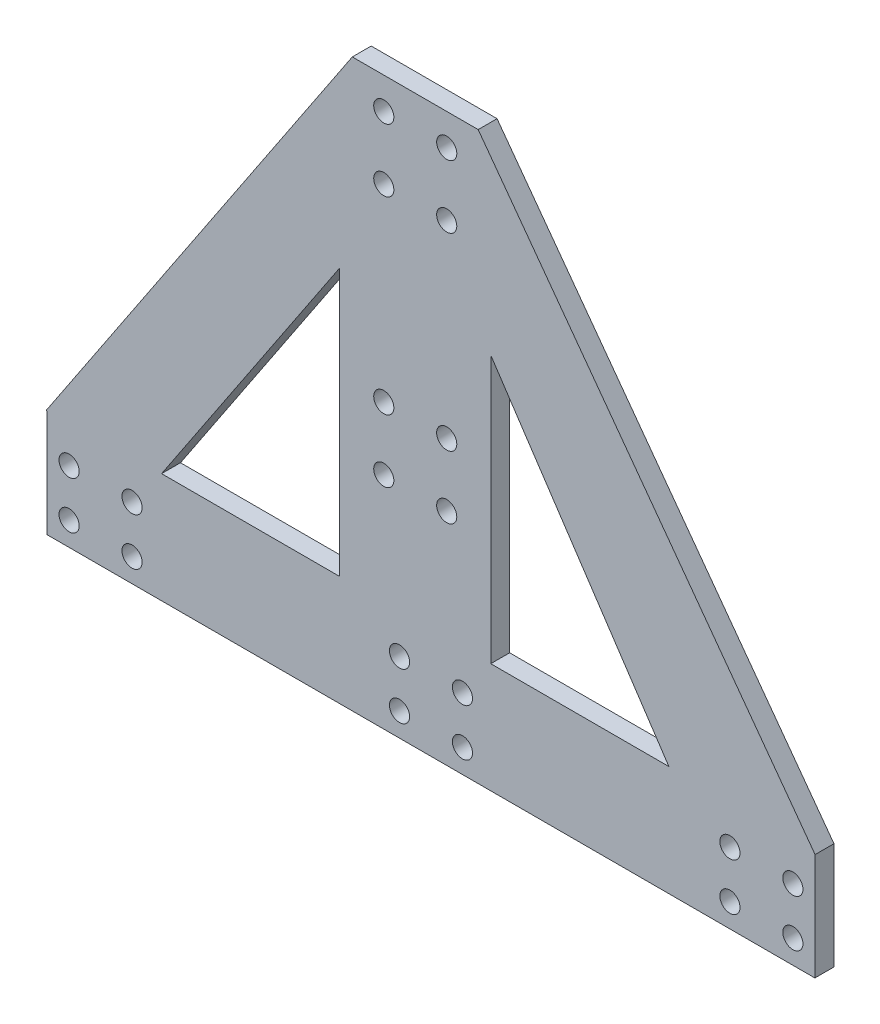
ISO-10303-21;
HEADER;
FILE_DESCRIPTION(('STEP AP214'),'2;1');
FILE_NAME('part.step','',(''),(''),'','','');
FILE_SCHEMA(('AUTOMOTIVE_DESIGN { 1 0 10303 214 1 1 1 1 }'));
ENDSEC;
DATA;
#1=APPLICATION_CONTEXT('core data for automotive mechanical design processes');
#2=APPLICATION_PROTOCOL_DEFINITION('international standard','automotive_design',2000,#1);
#3=PRODUCT_CONTEXT('',#1,'mechanical');
#4=PRODUCT('Part','Part','',(#3));
#5=PRODUCT_RELATED_PRODUCT_CATEGORY('part','',(#4));
#6=PRODUCT_DEFINITION_FORMATION('','',#4);
#7=PRODUCT_DEFINITION_CONTEXT('part definition',#1,'design');
#8=PRODUCT_DEFINITION('design','',#6,#7);
#9=PRODUCT_DEFINITION_SHAPE('','',#8);
#10=(LENGTH_UNIT() NAMED_UNIT(*) SI_UNIT(.MILLI.,.METRE.));
#11=(NAMED_UNIT(*) PLANE_ANGLE_UNIT() SI_UNIT($,.RADIAN.));
#12=(NAMED_UNIT(*) SI_UNIT($,.STERADIAN.) SOLID_ANGLE_UNIT());
#13=UNCERTAINTY_MEASURE_WITH_UNIT(LENGTH_MEASURE(1.E-05),#10,'distance_accuracy_value','');
#14=(GEOMETRIC_REPRESENTATION_CONTEXT(3) GLOBAL_UNCERTAINTY_ASSIGNED_CONTEXT((#13)) GLOBAL_UNIT_ASSIGNED_CONTEXT((#10,
#11,#12)) REPRESENTATION_CONTEXT('',''));
#15=CARTESIAN_POINT('',(0.,0.,0.));
#16=DIRECTION('',(0.,0.,1.));
#17=DIRECTION('',(1.,0.,0.));
#18=AXIS2_PLACEMENT_3D('',#15,#16,#17);
#19=CARTESIAN_POINT('',(-50.,-75.,3.));
#20=DIRECTION('',(0.832050294337844,-0.554700196225229,0.));
#21=DIRECTION('',(0.554700196225229,0.832050294337844,0.));
#22=AXIS2_PLACEMENT_3D('',#19,#20,#21);
#23=PLANE('',#22);
#24=DIRECTION('',(-0.554700196225229,-0.832050294337844,0.));
#25=VECTOR('',#24,1.);
#26=CARTESIAN_POINT('',(-50.,-75.,0.));
#27=LINE('',#26,#25);
#28=CARTESIAN_POINT('',(0.,0.,0.));
#29=VERTEX_POINT('',#28);
#30=CARTESIAN_POINT('',(-48.6666666666667,-73.,0.));
#31=VERTEX_POINT('',#30);
#32=EDGE_CURVE('E186',#29,#31,#27,.T.);
#33=ORIENTED_EDGE('',*,*,#32,.T.);
#34=DIRECTION('',(0.,0.,1.));
#35=VECTOR('',#34,1.);
#36=CARTESIAN_POINT('',(-48.6666666666667,-73.,3.));
#37=LINE('',#36,#35);
#38=CARTESIAN_POINT('',(-48.6666666666667,-73.,3.));
#39=VERTEX_POINT('',#38);
#40=EDGE_CURVE('E224',#31,#39,#37,.T.);
#41=ORIENTED_EDGE('',*,*,#40,.T.);
#42=DIRECTION('',(-0.554700196225229,-0.832050294337844,0.));
#43=VECTOR('',#42,1.);
#44=CARTESIAN_POINT('',(-50.,-75.,3.));
#45=LINE('',#44,#43);
#46=CARTESIAN_POINT('',(0.,0.,3.));
#47=VERTEX_POINT('',#46);
#48=EDGE_CURVE('E173',#47,#39,#45,.T.);
#49=ORIENTED_EDGE('',*,*,#48,.F.);
#50=DIRECTION('',(0.,0.,-1.));
#51=VECTOR('',#50,1.);
#52=CARTESIAN_POINT('',(0.,0.,3.));
#53=LINE('',#52,#51);
#54=EDGE_CURVE('E185',#47,#29,#53,.T.);
#55=ORIENTED_EDGE('',*,*,#54,.T.);
#56=EDGE_LOOP('',(#33,#41,#49,#55));
#57=FACE_BOUND('',#56,.T.);
#58=ADVANCED_FACE('F43',(#57),#23,.F.);
#59=CARTESIAN_POINT('',(75.,-90.,3.));
#60=DIRECTION('',(0.,1.,0.));
#61=DIRECTION('',(-1.,0.,0.));
#62=AXIS2_PLACEMENT_3D('',#59,#60,#61);
#63=PLANE('',#62);
#64=DIRECTION('',(1.,0.,0.));
#65=VECTOR('',#64,1.);
#66=CARTESIAN_POINT('',(75.,-90.,0.));
#67=LINE('',#66,#65);
#68=CARTESIAN_POINT('',(-48.5,-90.,0.));
#69=VERTEX_POINT('',#68);
#70=CARTESIAN_POINT('',(73.5,-90.,0.));
#71=VERTEX_POINT('',#70);
#72=EDGE_CURVE('E190',#69,#71,#67,.T.);
#73=ORIENTED_EDGE('',*,*,#72,.T.);
#74=DIRECTION('',(0.,0.,1.));
#75=VECTOR('',#74,1.);
#76=CARTESIAN_POINT('',(73.5,-90.,0.));
#77=LINE('',#76,#75);
#78=CARTESIAN_POINT('',(73.5,-90.,3.));
#79=VERTEX_POINT('',#78);
#80=EDGE_CURVE('E170',#71,#79,#77,.T.);
#81=ORIENTED_EDGE('',*,*,#80,.T.);
#82=DIRECTION('',(1.,0.,0.));
#83=VECTOR('',#82,1.);
#84=CARTESIAN_POINT('',(75.,-90.,3.));
#85=LINE('',#84,#83);
#86=CARTESIAN_POINT('',(-48.5,-90.,3.));
#87=VERTEX_POINT('',#86);
#88=EDGE_CURVE('E162',#87,#79,#85,.T.);
#89=ORIENTED_EDGE('',*,*,#88,.F.);
#90=DIRECTION('',(0.,0.,1.));
#91=VECTOR('',#90,1.);
#92=CARTESIAN_POINT('',(-48.5,-90.,0.));
#93=LINE('',#92,#91);
#94=EDGE_CURVE('E143',#69,#87,#93,.T.);
#95=ORIENTED_EDGE('',*,*,#94,.F.);
#96=EDGE_LOOP('',(#73,#81,#89,#95));
#97=FACE_BOUND('',#96,.T.);
#98=ADVANCED_FACE('F169',(#97),#63,.F.);
#99=CARTESIAN_POINT('',(20.,0.,3.));
#100=DIRECTION('',(-0.806404995855706,-0.591363663627517,0.));
#101=DIRECTION('',(0.591363663627517,-0.806404995855706,0.));
#102=AXIS2_PLACEMENT_3D('',#99,#100,#101);
#103=PLANE('',#102);
#104=DIRECTION('',(-0.591363663627517,0.806404995855705,0.));
#105=VECTOR('',#104,1.);
#106=CARTESIAN_POINT('',(20.,0.,3.));
#107=LINE('',#106,#105);
#108=CARTESIAN_POINT('',(73.5333333333333,-73.,3.));
#109=VERTEX_POINT('',#108);
#110=CARTESIAN_POINT('',(20.,0.,3.));
#111=VERTEX_POINT('',#110);
#112=EDGE_CURVE('E172',#109,#111,#107,.T.);
#113=ORIENTED_EDGE('',*,*,#112,.F.);
#114=DIRECTION('',(0.,0.,-1.));
#115=VECTOR('',#114,1.);
#116=CARTESIAN_POINT('',(73.5333333333333,-73.,3.));
#117=LINE('',#116,#115);
#118=CARTESIAN_POINT('',(73.5333333333333,-73.,0.));
#119=VERTEX_POINT('',#118);
#120=EDGE_CURVE('E191',#109,#119,#117,.T.);
#121=ORIENTED_EDGE('',*,*,#120,.T.);
#122=DIRECTION('',(-0.591363663627517,0.806404995855705,0.));
#123=VECTOR('',#122,1.);
#124=CARTESIAN_POINT('',(20.,0.,0.));
#125=LINE('',#124,#123);
#126=CARTESIAN_POINT('',(20.,0.,0.));
#127=VERTEX_POINT('',#126);
#128=EDGE_CURVE('E194',#119,#127,#125,.T.);
#129=ORIENTED_EDGE('',*,*,#128,.T.);
#130=DIRECTION('',(0.,0.,-1.));
#131=VECTOR('',#130,1.);
#132=CARTESIAN_POINT('',(20.,0.,3.));
#133=LINE('',#132,#131);
#134=EDGE_CURVE('E51',#111,#127,#133,.T.);
#135=ORIENTED_EDGE('',*,*,#134,.F.);
#136=EDGE_LOOP('',(#113,#121,#129,#135));
#137=FACE_BOUND('',#136,.T.);
#138=ADVANCED_FACE('F228',(#137),#103,.F.);
#139=CARTESIAN_POINT('',(0.,0.,3.));
#140=DIRECTION('',(0.,-1.,0.));
#141=DIRECTION('',(0.,0.,-1.));
#142=AXIS2_PLACEMENT_3D('',#139,#140,#141);
#143=PLANE('',#142);
#144=DIRECTION('',(-1.,0.,0.));
#145=VECTOR('',#144,1.);
#146=CARTESIAN_POINT('',(0.,0.,0.));
#147=LINE('',#146,#145);
#148=EDGE_CURVE('E179',#127,#29,#147,.T.);
#149=ORIENTED_EDGE('',*,*,#148,.T.);
#150=ORIENTED_EDGE('',*,*,#54,.F.);
#151=DIRECTION('',(-1.,0.,0.));
#152=VECTOR('',#151,1.);
#153=CARTESIAN_POINT('',(0.,0.,3.));
#154=LINE('',#153,#152);
#155=EDGE_CURVE('E177',#111,#47,#154,.T.);
#156=ORIENTED_EDGE('',*,*,#155,.F.);
#157=ORIENTED_EDGE('',*,*,#134,.T.);
#158=EDGE_LOOP('',(#149,#150,#156,#157));
#159=FACE_BOUND('',#158,.T.);
#160=ADVANCED_FACE('F207',(#159),#143,.F.);
#161=CARTESIAN_POINT('',(0.,0.,3.));
#162=DIRECTION('',(0.,0.,-1.));
#163=DIRECTION('',(-1.,0.,0.));
#164=AXIS2_PLACEMENT_3D('',#161,#162,#163);
#165=PLANE('',#164);
#166=DIRECTION('',(1.,0.,0.));
#167=VECTOR('',#166,1.);
#168=CARTESIAN_POINT('',(-1.99999999999999,-72.5,3.));
#169=LINE('',#168,#167);
#170=CARTESIAN_POINT('',(-30.3055769560134,-72.5,3.));
#171=VERTEX_POINT('',#170);
#172=CARTESIAN_POINT('',(-1.99999999999999,-72.5,3.));
#173=VERTEX_POINT('',#172);
#174=EDGE_CURVE('E340',#171,#173,#169,.T.);
#175=ORIENTED_EDGE('',*,*,#174,.F.);
#176=DIRECTION('',(-0.554700196225229,-0.832050294337844,0.));
#177=VECTOR('',#176,1.);
#178=CARTESIAN_POINT('',(-30.3055769560134,-72.5,3.));
#179=LINE('',#178,#177);
#180=CARTESIAN_POINT('',(-2.,-30.0416345659799,3.));
#181=VERTEX_POINT('',#180);
#182=EDGE_CURVE('E58',#181,#171,#179,.T.);
#183=ORIENTED_EDGE('',*,*,#182,.F.);
#184=DIRECTION('',(0.,1.,0.));
#185=VECTOR('',#184,1.);
#186=CARTESIAN_POINT('',(-2.,-30.0416345659799,3.));
#187=LINE('',#186,#185);
#188=EDGE_CURVE('E327',#173,#181,#187,.T.);
#189=ORIENTED_EDGE('',*,*,#188,.F.);
#190=EDGE_LOOP('',(#175,#183,#189));
#191=FACE_BOUND('',#190,.T.);
#192=CARTESIAN_POINT('',(70.,-86.25,3.));
#193=DIRECTION('',(0.,0.,1.));
#194=DIRECTION('',(-1.,0.,0.));
#195=AXIS2_PLACEMENT_3D('',#192,#193,#194);
#196=CIRCLE('',#195,1.60000000000001);
#197=CARTESIAN_POINT('',(68.4,-86.25,3.));
#198=VERTEX_POINT('',#197);
#199=EDGE_CURVE('E312',#198,#198,#196,.T.);
#200=ORIENTED_EDGE('',*,*,#199,.F.);
#201=EDGE_LOOP('',(#200));
#202=FACE_BOUND('',#201,.T.);
#203=CARTESIAN_POINT('',(70.,-78.75,3.));
#204=DIRECTION('',(0.,0.,1.));
#205=DIRECTION('',(1.,0.,0.));
#206=AXIS2_PLACEMENT_3D('',#203,#204,#205);
#207=CIRCLE('',#206,1.59999999999999);
#208=CARTESIAN_POINT('',(71.6,-78.75,3.));
#209=VERTEX_POINT('',#208);
#210=EDGE_CURVE('E311',#209,#209,#207,.T.);
#211=ORIENTED_EDGE('',*,*,#210,.F.);
#212=EDGE_LOOP('',(#211));
#213=FACE_BOUND('',#212,.T.);
#214=CARTESIAN_POINT('',(60.,-86.25,3.));
#215=DIRECTION('',(0.,0.,1.));
#216=DIRECTION('',(1.,0.,0.));
#217=AXIS2_PLACEMENT_3D('',#214,#215,#216);
#218=CIRCLE('',#217,1.6);
#219=CARTESIAN_POINT('',(61.6,-86.25,3.));
#220=VERTEX_POINT('',#219);
#221=EDGE_CURVE('E296',#220,#220,#218,.T.);
#222=ORIENTED_EDGE('',*,*,#221,.F.);
#223=EDGE_LOOP('',(#222));
#224=FACE_BOUND('',#223,.T.);
#225=DIRECTION('',(1.,0.,0.));
#226=VECTOR('',#225,1.);
#227=CARTESIAN_POINT('',(22.,-72.4999999999999,3.));
#228=LINE('',#227,#226);
#229=CARTESIAN_POINT('',(22.,-72.4999999999999,3.));
#230=VERTEX_POINT('',#229);
#231=CARTESIAN_POINT('',(50.3055769560134,-72.5,3.));
#232=VERTEX_POINT('',#231);
#233=EDGE_CURVE('E395',#230,#232,#228,.T.);
#234=ORIENTED_EDGE('',*,*,#233,.F.);
#235=DIRECTION('',(0.,-1.,0.));
#236=VECTOR('',#235,1.);
#237=CARTESIAN_POINT('',(22.,-30.0416345659799,3.));
#238=LINE('',#237,#236);
#239=CARTESIAN_POINT('',(22.,-30.0416345659799,3.));
#240=VERTEX_POINT('',#239);
#241=EDGE_CURVE('E66',#240,#230,#238,.T.);
#242=ORIENTED_EDGE('',*,*,#241,.F.);
#243=DIRECTION('',(-0.554700196225229,0.832050294337844,0.));
#244=VECTOR('',#243,1.);
#245=CARTESIAN_POINT('',(50.3055769560134,-72.5,3.));
#246=LINE('',#245,#244);
#247=EDGE_CURVE('E383',#232,#240,#246,.T.);
#248=ORIENTED_EDGE('',*,*,#247,.F.);
#249=EDGE_LOOP('',(#234,#242,#248));
#250=FACE_BOUND('',#249,.T.);
#251=CARTESIAN_POINT('',(7.50000000000001,-86.25,3.));
#252=DIRECTION('',(0.,0.,1.));
#253=DIRECTION('',(1.,0.,0.));
#254=AXIS2_PLACEMENT_3D('',#251,#252,#253);
#255=CIRCLE('',#254,1.6);
#256=CARTESIAN_POINT('',(9.10000000000001,-86.25,3.));
#257=VERTEX_POINT('',#256);
#258=EDGE_CURVE('E374',#257,#257,#255,.T.);
#259=ORIENTED_EDGE('',*,*,#258,.F.);
#260=EDGE_LOOP('',(#259));
#261=FACE_BOUND('',#260,.T.);
#262=CARTESIAN_POINT('',(17.5,-86.25,3.));
#263=DIRECTION('',(0.,0.,1.));
#264=DIRECTION('',(-1.,0.,0.));
#265=AXIS2_PLACEMENT_3D('',#262,#263,#264);
#266=CIRCLE('',#265,1.6);
#267=CARTESIAN_POINT('',(15.9,-86.25,3.));
#268=VERTEX_POINT('',#267);
#269=EDGE_CURVE('E365',#268,#268,#266,.T.);
#270=ORIENTED_EDGE('',*,*,#269,.F.);
#271=EDGE_LOOP('',(#270));
#272=FACE_BOUND('',#271,.T.);
#273=CARTESIAN_POINT('',(15.,-5.,3.));
#274=DIRECTION('',(0.,0.,1.));
#275=DIRECTION('',(-1.,0.,0.));
#276=AXIS2_PLACEMENT_3D('',#273,#274,#275);
#277=CIRCLE('',#276,1.6);
#278=CARTESIAN_POINT('',(13.4,-5.,3.));
#279=VERTEX_POINT('',#278);
#280=EDGE_CURVE('E239',#279,#279,#277,.T.);
#281=ORIENTED_EDGE('',*,*,#280,.F.);
#282=EDGE_LOOP('',(#281));
#283=FACE_BOUND('',#282,.T.);
#284=CARTESIAN_POINT('',(15.,-15.,3.));
#285=DIRECTION('',(0.,0.,1.));
#286=DIRECTION('',(1.,0.,0.));
#287=AXIS2_PLACEMENT_3D('',#284,#285,#286);
#288=CIRCLE('',#287,1.6);
#289=CARTESIAN_POINT('',(16.6,-15.,3.));
#290=VERTEX_POINT('',#289);
#291=EDGE_CURVE('E264',#290,#290,#288,.T.);
#292=ORIENTED_EDGE('',*,*,#291,.F.);
#293=EDGE_LOOP('',(#292));
#294=FACE_BOUND('',#293,.T.);
#295=CARTESIAN_POINT('',(5.,-15.,3.));
#296=DIRECTION('',(0.,0.,1.));
#297=DIRECTION('',(-1.,0.,0.));
#298=AXIS2_PLACEMENT_3D('',#295,#296,#297);
#299=CIRCLE('',#298,1.6);
#300=CARTESIAN_POINT('',(3.4,-15.,3.));
#301=VERTEX_POINT('',#300);
#302=EDGE_CURVE('E256',#301,#301,#299,.T.);
#303=ORIENTED_EDGE('',*,*,#302,.F.);
#304=EDGE_LOOP('',(#303));
#305=FACE_BOUND('',#304,.T.);
#306=CARTESIAN_POINT('',(-45.,-86.25,3.));
#307=DIRECTION('',(0.,0.,1.));
#308=DIRECTION('',(1.,0.,0.));
#309=AXIS2_PLACEMENT_3D('',#306,#307,#308);
#310=CIRCLE('',#309,1.6);
#311=CARTESIAN_POINT('',(-43.4,-86.25,3.));
#312=VERTEX_POINT('',#311);
#313=EDGE_CURVE('E247',#312,#312,#310,.T.);
#314=ORIENTED_EDGE('',*,*,#313,.F.);
#315=EDGE_LOOP('',(#314));
#316=FACE_BOUND('',#315,.T.);
#317=CARTESIAN_POINT('',(60.,-78.75,3.));
#318=DIRECTION('',(0.,0.,1.));
#319=DIRECTION('',(-1.,0.,0.));
#320=AXIS2_PLACEMENT_3D('',#317,#318,#319);
#321=CIRCLE('',#320,1.60000000000001);
#322=CARTESIAN_POINT('',(58.4,-78.75,3.));
#323=VERTEX_POINT('',#322);
#324=EDGE_CURVE('E295',#323,#323,#321,.T.);
#325=ORIENTED_EDGE('',*,*,#324,.F.);
#326=EDGE_LOOP('',(#325));
#327=FACE_BOUND('',#326,.T.);
#328=CARTESIAN_POINT('',(-35.,-78.75,3.));
#329=DIRECTION('',(0.,0.,1.));
#330=DIRECTION('',(1.,0.,0.));
#331=AXIS2_PLACEMENT_3D('',#328,#329,#330);
#332=CIRCLE('',#331,1.6);
#333=CARTESIAN_POINT('',(-33.4,-78.75,3.));
#334=VERTEX_POINT('',#333);
#335=EDGE_CURVE('E280',#334,#334,#332,.T.);
#336=ORIENTED_EDGE('',*,*,#335,.F.);
#337=EDGE_LOOP('',(#336));
#338=FACE_BOUND('',#337,.T.);
#339=CARTESIAN_POINT('',(-35.,-86.25,3.));
#340=DIRECTION('',(0.,0.,1.));
#341=DIRECTION('',(-1.,0.,0.));
#342=AXIS2_PLACEMENT_3D('',#339,#340,#341);
#343=CIRCLE('',#342,1.6);
#344=CARTESIAN_POINT('',(-36.6,-86.25,3.));
#345=VERTEX_POINT('',#344);
#346=EDGE_CURVE('E279',#345,#345,#343,.T.);
#347=ORIENTED_EDGE('',*,*,#346,.F.);
#348=EDGE_LOOP('',(#347));
#349=FACE_BOUND('',#348,.T.);
#350=CARTESIAN_POINT('',(-45.,-78.75,3.));
#351=DIRECTION('',(0.,0.,1.));
#352=DIRECTION('',(-1.,0.,0.));
#353=AXIS2_PLACEMENT_3D('',#350,#351,#352);
#354=CIRCLE('',#353,1.6);
#355=CARTESIAN_POINT('',(-46.6,-78.75,3.));
#356=VERTEX_POINT('',#355);
#357=EDGE_CURVE('E248',#356,#356,#354,.T.);
#358=ORIENTED_EDGE('',*,*,#357,.F.);
#359=EDGE_LOOP('',(#358));
#360=FACE_BOUND('',#359,.T.);
#361=CARTESIAN_POINT('',(5.00000000000001,-55.,3.));
#362=DIRECTION('',(0.,0.,1.));
#363=DIRECTION('',(-1.,0.,0.));
#364=AXIS2_PLACEMENT_3D('',#361,#362,#363);
#365=CIRCLE('',#364,1.6);
#366=CARTESIAN_POINT('',(3.40000000000002,-55.,3.));
#367=VERTEX_POINT('',#366);
#368=EDGE_CURVE('E457',#367,#367,#365,.T.);
#369=ORIENTED_EDGE('',*,*,#368,.F.);
#370=EDGE_LOOP('',(#369));
#371=FACE_BOUND('',#370,.T.);
#372=CARTESIAN_POINT('',(15.,-55.,3.));
#373=DIRECTION('',(0.,0.,1.));
#374=DIRECTION('',(1.,0.,0.));
#375=AXIS2_PLACEMENT_3D('',#372,#373,#374);
#376=CIRCLE('',#375,1.6);
#377=CARTESIAN_POINT('',(16.6,-55.,3.));
#378=VERTEX_POINT('',#377);
#379=EDGE_CURVE('E465',#378,#378,#376,.T.);
#380=ORIENTED_EDGE('',*,*,#379,.F.);
#381=EDGE_LOOP('',(#380));
#382=FACE_BOUND('',#381,.T.);
#383=CARTESIAN_POINT('',(15.,-45.,3.));
#384=DIRECTION('',(0.,0.,1.));
#385=DIRECTION('',(-1.,0.,0.));
#386=AXIS2_PLACEMENT_3D('',#383,#384,#385);
#387=CIRCLE('',#386,1.6);
#388=CARTESIAN_POINT('',(13.4,-45.,3.));
#389=VERTEX_POINT('',#388);
#390=EDGE_CURVE('E441',#389,#389,#387,.T.);
#391=ORIENTED_EDGE('',*,*,#390,.F.);
#392=EDGE_LOOP('',(#391));
#393=FACE_BOUND('',#392,.T.);
#394=CARTESIAN_POINT('',(17.5,-78.75,3.));
#395=DIRECTION('',(0.,0.,1.));
#396=DIRECTION('',(1.,0.,0.));
#397=AXIS2_PLACEMENT_3D('',#394,#395,#396);
#398=CIRCLE('',#397,1.6);
#399=CARTESIAN_POINT('',(19.1,-78.75,3.));
#400=VERTEX_POINT('',#399);
#401=EDGE_CURVE('E366',#400,#400,#398,.T.);
#402=ORIENTED_EDGE('',*,*,#401,.F.);
#403=EDGE_LOOP('',(#402));
#404=FACE_BOUND('',#403,.T.);
#405=CARTESIAN_POINT('',(7.50000000000001,-78.75,3.));
#406=DIRECTION('',(0.,0.,1.));
#407=DIRECTION('',(-1.,0.,0.));
#408=AXIS2_PLACEMENT_3D('',#405,#406,#407);
#409=CIRCLE('',#408,1.6);
#410=CARTESIAN_POINT('',(5.90000000000001,-78.75,3.));
#411=VERTEX_POINT('',#410);
#412=EDGE_CURVE('E426',#411,#411,#409,.T.);
#413=ORIENTED_EDGE('',*,*,#412,.F.);
#414=EDGE_LOOP('',(#413));
#415=FACE_BOUND('',#414,.T.);
#416=CARTESIAN_POINT('',(5.00000000000001,-45.,3.));
#417=DIRECTION('',(0.,0.,1.));
#418=DIRECTION('',(1.,0.,0.));
#419=AXIS2_PLACEMENT_3D('',#416,#417,#418);
#420=CIRCLE('',#419,1.6);
#421=CARTESIAN_POINT('',(6.60000000000001,-45.,3.));
#422=VERTEX_POINT('',#421);
#423=EDGE_CURVE('E156',#422,#422,#420,.T.);
#424=ORIENTED_EDGE('',*,*,#423,.F.);
#425=EDGE_LOOP('',(#424));
#426=FACE_BOUND('',#425,.T.);
#427=CARTESIAN_POINT('',(5.,-5.,3.));
#428=DIRECTION('',(0.,0.,1.));
#429=DIRECTION('',(1.,0.,0.));
#430=AXIS2_PLACEMENT_3D('',#427,#428,#429);
#431=CIRCLE('',#430,1.6);
#432=CARTESIAN_POINT('',(6.6,-5.,3.));
#433=VERTEX_POINT('',#432);
#434=EDGE_CURVE('E235',#433,#433,#431,.T.);
#435=ORIENTED_EDGE('',*,*,#434,.F.);
#436=EDGE_LOOP('',(#435));
#437=FACE_BOUND('',#436,.T.);
#438=ORIENTED_EDGE('',*,*,#88,.T.);
#439=DIRECTION('',(0.,-1.,0.));
#440=VECTOR('',#439,1.);
#441=CARTESIAN_POINT('',(73.5,-90.,3.));
#442=LINE('',#441,#440);
#443=CARTESIAN_POINT('',(73.5,-73.,3.));
#444=VERTEX_POINT('',#443);
#445=EDGE_CURVE('E412',#444,#79,#442,.T.);
#446=ORIENTED_EDGE('',*,*,#445,.F.);
#447=DIRECTION('',(-1.,0.,0.));
#448=VECTOR('',#447,1.);
#449=CARTESIAN_POINT('',(73.5,-73.,3.));
#450=LINE('',#449,#448);
#451=EDGE_CURVE('E226',#109,#444,#450,.T.);
#452=ORIENTED_EDGE('',*,*,#451,.F.);
#453=ORIENTED_EDGE('',*,*,#112,.T.);
#454=ORIENTED_EDGE('',*,*,#155,.T.);
#455=ORIENTED_EDGE('',*,*,#48,.T.);
#456=DIRECTION('',(-1.,0.,0.));
#457=VECTOR('',#456,1.);
#458=CARTESIAN_POINT('',(-48.5,-73.,3.));
#459=LINE('',#458,#457);
#460=CARTESIAN_POINT('',(-48.5,-73.,3.));
#461=VERTEX_POINT('',#460);
#462=EDGE_CURVE('E164',#461,#39,#459,.T.);
#463=ORIENTED_EDGE('',*,*,#462,.F.);
#464=DIRECTION('',(0.,1.,0.));
#465=VECTOR('',#464,1.);
#466=CARTESIAN_POINT('',(-48.5,-90.,3.));
#467=LINE('',#466,#465);
#468=EDGE_CURVE('E146',#87,#461,#467,.T.);
#469=ORIENTED_EDGE('',*,*,#468,.F.);
#470=EDGE_LOOP('',(#438,#446,#452,#453,#454,#455,#463,#469));
#471=FACE_BOUND('',#470,.T.);
#472=ADVANCED_FACE('F160',(#191,#202,#213,#224,#250,#261,#272,#283,#294,#305,#316,#327,#338,
#349,#360,#371,#382,#393,#404,#415,#426,#437,#471),#165,.F.);
#473=CARTESIAN_POINT('',(0.,0.,0.));
#474=DIRECTION('',(0.,0.,-1.));
#475=DIRECTION('',(-1.,0.,0.));
#476=AXIS2_PLACEMENT_3D('',#473,#474,#475);
#477=PLANE('',#476);
#478=DIRECTION('',(-0.554700196225229,-0.832050294337844,0.));
#479=VECTOR('',#478,1.);
#480=CARTESIAN_POINT('',(-30.3055769560134,-72.5,0.));
#481=LINE('',#480,#479);
#482=CARTESIAN_POINT('',(-2.,-30.0416345659799,0.));
#483=VERTEX_POINT('',#482);
#484=CARTESIAN_POINT('',(-30.3055769560134,-72.5,0.));
#485=VERTEX_POINT('',#484);
#486=EDGE_CURVE('E323',#483,#485,#481,.T.);
#487=ORIENTED_EDGE('',*,*,#486,.T.);
#488=DIRECTION('',(1.,0.,0.));
#489=VECTOR('',#488,1.);
#490=CARTESIAN_POINT('',(-1.99999999999999,-72.5,0.));
#491=LINE('',#490,#489);
#492=CARTESIAN_POINT('',(-1.99999999999999,-72.5,0.));
#493=VERTEX_POINT('',#492);
#494=EDGE_CURVE('E328',#485,#493,#491,.T.);
#495=ORIENTED_EDGE('',*,*,#494,.T.);
#496=DIRECTION('',(0.,1.,0.));
#497=VECTOR('',#496,1.);
#498=CARTESIAN_POINT('',(-2.,-30.0416345659799,0.));
#499=LINE('',#498,#497);
#500=EDGE_CURVE('E332',#493,#483,#499,.T.);
#501=ORIENTED_EDGE('',*,*,#500,.T.);
#502=EDGE_LOOP('',(#487,#495,#501));
#503=FACE_BOUND('',#502,.T.);
#504=CARTESIAN_POINT('',(70.,-86.25,0.));
#505=DIRECTION('',(0.,0.,1.));
#506=DIRECTION('',(-1.,0.,0.));
#507=AXIS2_PLACEMENT_3D('',#504,#505,#506);
#508=CIRCLE('',#507,1.60000000000001);
#509=CARTESIAN_POINT('',(68.4,-86.25,0.));
#510=VERTEX_POINT('',#509);
#511=EDGE_CURVE('E339',#510,#510,#508,.T.);
#512=ORIENTED_EDGE('',*,*,#511,.T.);
#513=EDGE_LOOP('',(#512));
#514=FACE_BOUND('',#513,.T.);
#515=CARTESIAN_POINT('',(70.,-78.75,0.));
#516=DIRECTION('',(0.,0.,1.));
#517=DIRECTION('',(1.,0.,0.));
#518=AXIS2_PLACEMENT_3D('',#515,#516,#517);
#519=CIRCLE('',#518,1.59999999999999);
#520=CARTESIAN_POINT('',(71.6,-78.75,0.));
#521=VERTEX_POINT('',#520);
#522=EDGE_CURVE('E307',#521,#521,#519,.T.);
#523=ORIENTED_EDGE('',*,*,#522,.T.);
#524=EDGE_LOOP('',(#523));
#525=FACE_BOUND('',#524,.T.);
#526=CARTESIAN_POINT('',(60.,-86.25,0.));
#527=DIRECTION('',(0.,0.,1.));
#528=DIRECTION('',(1.,0.,0.));
#529=AXIS2_PLACEMENT_3D('',#526,#527,#528);
#530=CIRCLE('',#529,1.6);
#531=CARTESIAN_POINT('',(61.6,-86.25,0.));
#532=VERTEX_POINT('',#531);
#533=EDGE_CURVE('E316',#532,#532,#530,.T.);
#534=ORIENTED_EDGE('',*,*,#533,.T.);
#535=EDGE_LOOP('',(#534));
#536=FACE_BOUND('',#535,.T.);
#537=DIRECTION('',(0.,-1.,0.));
#538=VECTOR('',#537,1.);
#539=CARTESIAN_POINT('',(73.5,-90.,0.));
#540=LINE('',#539,#538);
#541=CARTESIAN_POINT('',(73.5,-73.,0.));
#542=VERTEX_POINT('',#541);
#543=EDGE_CURVE('E409',#542,#71,#540,.T.);
#544=ORIENTED_EDGE('',*,*,#543,.T.);
#545=ORIENTED_EDGE('',*,*,#72,.F.);
#546=DIRECTION('',(0.,1.,0.));
#547=VECTOR('',#546,1.);
#548=CARTESIAN_POINT('',(-48.5,-90.,0.));
#549=LINE('',#548,#547);
#550=CARTESIAN_POINT('',(-48.5,-73.,0.));
#551=VERTEX_POINT('',#550);
#552=EDGE_CURVE('E149',#69,#551,#549,.T.);
#553=ORIENTED_EDGE('',*,*,#552,.T.);
#554=DIRECTION('',(-1.,0.,0.));
#555=VECTOR('',#554,1.);
#556=CARTESIAN_POINT('',(-48.5,-73.,0.));
#557=LINE('',#556,#555);
#558=EDGE_CURVE('E220',#551,#31,#557,.T.);
#559=ORIENTED_EDGE('',*,*,#558,.T.);
#560=ORIENTED_EDGE('',*,*,#32,.F.);
#561=ORIENTED_EDGE('',*,*,#148,.F.);
#562=ORIENTED_EDGE('',*,*,#128,.F.);
#563=DIRECTION('',(1.,0.,0.));
#564=VECTOR('',#563,1.);
#565=CARTESIAN_POINT('',(0.,-73.,0.));
#566=LINE('',#565,#564);
#567=EDGE_CURVE('E11',#542,#119,#566,.T.);
#568=ORIENTED_EDGE('',*,*,#567,.F.);
#569=EDGE_LOOP('',(#544,#545,#553,#559,#560,#561,#562,#568));
#570=FACE_BOUND('',#569,.T.);
#571=DIRECTION('',(0.,-1.,0.));
#572=VECTOR('',#571,1.);
#573=CARTESIAN_POINT('',(22.,-30.0416345659799,0.));
#574=LINE('',#573,#572);
#575=CARTESIAN_POINT('',(22.,-30.0416345659799,0.));
#576=VERTEX_POINT('',#575);
#577=CARTESIAN_POINT('',(22.,-72.4999999999999,0.));
#578=VERTEX_POINT('',#577);
#579=EDGE_CURVE('E379',#576,#578,#574,.T.);
#580=ORIENTED_EDGE('',*,*,#579,.T.);
#581=DIRECTION('',(1.,0.,0.));
#582=VECTOR('',#581,1.);
#583=CARTESIAN_POINT('',(22.,-72.4999999999999,0.));
#584=LINE('',#583,#582);
#585=CARTESIAN_POINT('',(50.3055769560134,-72.5,0.));
#586=VERTEX_POINT('',#585);
#587=EDGE_CURVE('E384',#578,#586,#584,.T.);
#588=ORIENTED_EDGE('',*,*,#587,.T.);
#589=DIRECTION('',(-0.554700196225229,0.832050294337844,0.));
#590=VECTOR('',#589,1.);
#591=CARTESIAN_POINT('',(50.3055769560134,-72.5,0.));
#592=LINE('',#591,#590);
#593=EDGE_CURVE('E388',#586,#576,#592,.T.);
#594=ORIENTED_EDGE('',*,*,#593,.T.);
#595=EDGE_LOOP('',(#580,#588,#594));
#596=FACE_BOUND('',#595,.T.);
#597=CARTESIAN_POINT('',(7.50000000000001,-86.25,0.));
#598=DIRECTION('',(0.,0.,1.));
#599=DIRECTION('',(1.,0.,0.));
#600=AXIS2_PLACEMENT_3D('',#597,#598,#599);
#601=CIRCLE('',#600,1.6);
#602=CARTESIAN_POINT('',(9.10000000000001,-86.25,0.));
#603=VERTEX_POINT('',#602);
#604=EDGE_CURVE('E370',#603,#603,#601,.T.);
#605=ORIENTED_EDGE('',*,*,#604,.T.);
#606=EDGE_LOOP('',(#605));
#607=FACE_BOUND('',#606,.T.);
#608=CARTESIAN_POINT('',(17.5,-86.25,0.));
#609=DIRECTION('',(0.,0.,1.));
#610=DIRECTION('',(-1.,0.,0.));
#611=AXIS2_PLACEMENT_3D('',#608,#609,#610);
#612=CIRCLE('',#611,1.6);
#613=CARTESIAN_POINT('',(15.9,-86.25,0.));
#614=VERTEX_POINT('',#613);
#615=EDGE_CURVE('E361',#614,#614,#612,.T.);
#616=ORIENTED_EDGE('',*,*,#615,.T.);
#617=EDGE_LOOP('',(#616));
#618=FACE_BOUND('',#617,.T.);
#619=CARTESIAN_POINT('',(15.,-5.,0.));
#620=DIRECTION('',(0.,0.,1.));
#621=DIRECTION('',(-1.,0.,0.));
#622=AXIS2_PLACEMENT_3D('',#619,#620,#621);
#623=CIRCLE('',#622,1.6);
#624=CARTESIAN_POINT('',(13.4,-5.,0.));
#625=VERTEX_POINT('',#624);
#626=EDGE_CURVE('E268',#625,#625,#623,.T.);
#627=ORIENTED_EDGE('',*,*,#626,.T.);
#628=EDGE_LOOP('',(#627));
#629=FACE_BOUND('',#628,.T.);
#630=CARTESIAN_POINT('',(15.,-15.,0.));
#631=DIRECTION('',(0.,0.,1.));
#632=DIRECTION('',(1.,0.,0.));
#633=AXIS2_PLACEMENT_3D('',#630,#631,#632);
#634=CIRCLE('',#633,1.6);
#635=CARTESIAN_POINT('',(16.6,-15.,0.));
#636=VERTEX_POINT('',#635);
#637=EDGE_CURVE('E260',#636,#636,#634,.T.);
#638=ORIENTED_EDGE('',*,*,#637,.T.);
#639=EDGE_LOOP('',(#638));
#640=FACE_BOUND('',#639,.T.);
#641=CARTESIAN_POINT('',(5.,-15.,0.));
#642=DIRECTION('',(0.,0.,1.));
#643=DIRECTION('',(-1.,0.,0.));
#644=AXIS2_PLACEMENT_3D('',#641,#642,#643);
#645=CIRCLE('',#644,1.6);
#646=CARTESIAN_POINT('',(3.4,-15.,0.));
#647=VERTEX_POINT('',#646);
#648=EDGE_CURVE('E252',#647,#647,#645,.T.);
#649=ORIENTED_EDGE('',*,*,#648,.T.);
#650=EDGE_LOOP('',(#649));
#651=FACE_BOUND('',#650,.T.);
#652=CARTESIAN_POINT('',(-45.,-86.25,0.));
#653=DIRECTION('',(0.,0.,1.));
#654=DIRECTION('',(1.,0.,0.));
#655=AXIS2_PLACEMENT_3D('',#652,#653,#654);
#656=CIRCLE('',#655,1.6);
#657=CARTESIAN_POINT('',(-43.4,-86.25,0.));
#658=VERTEX_POINT('',#657);
#659=EDGE_CURVE('E243',#658,#658,#656,.T.);
#660=ORIENTED_EDGE('',*,*,#659,.T.);
#661=EDGE_LOOP('',(#660));
#662=FACE_BOUND('',#661,.T.);
#663=CARTESIAN_POINT('',(60.,-78.75,0.));
#664=DIRECTION('',(0.,0.,1.));
#665=DIRECTION('',(-1.,0.,0.));
#666=AXIS2_PLACEMENT_3D('',#663,#664,#665);
#667=CIRCLE('',#666,1.60000000000001);
#668=CARTESIAN_POINT('',(58.4,-78.75,0.));
#669=VERTEX_POINT('',#668);
#670=EDGE_CURVE('E291',#669,#669,#667,.T.);
#671=ORIENTED_EDGE('',*,*,#670,.T.);
#672=EDGE_LOOP('',(#671));
#673=FACE_BOUND('',#672,.T.);
#674=CARTESIAN_POINT('',(-35.,-78.75,0.));
#675=DIRECTION('',(0.,0.,1.));
#676=DIRECTION('',(1.,0.,0.));
#677=AXIS2_PLACEMENT_3D('',#674,#675,#676);
#678=CIRCLE('',#677,1.6);
#679=CARTESIAN_POINT('',(-33.4,-78.75,0.));
#680=VERTEX_POINT('',#679);
#681=EDGE_CURVE('E300',#680,#680,#678,.T.);
#682=ORIENTED_EDGE('',*,*,#681,.T.);
#683=EDGE_LOOP('',(#682));
#684=FACE_BOUND('',#683,.T.);
#685=CARTESIAN_POINT('',(-35.,-86.25,0.));
#686=DIRECTION('',(0.,0.,1.));
#687=DIRECTION('',(-1.,0.,0.));
#688=AXIS2_PLACEMENT_3D('',#685,#686,#687);
#689=CIRCLE('',#688,1.6);
#690=CARTESIAN_POINT('',(-36.6,-86.25,0.));
#691=VERTEX_POINT('',#690);
#692=EDGE_CURVE('E275',#691,#691,#689,.T.);
#693=ORIENTED_EDGE('',*,*,#692,.T.);
#694=EDGE_LOOP('',(#693));
#695=FACE_BOUND('',#694,.T.);
#696=CARTESIAN_POINT('',(-45.,-78.75,0.));
#697=DIRECTION('',(0.,0.,1.));
#698=DIRECTION('',(-1.,0.,0.));
#699=AXIS2_PLACEMENT_3D('',#696,#697,#698);
#700=CIRCLE('',#699,1.6);
#701=CARTESIAN_POINT('',(-46.6,-78.75,0.));
#702=VERTEX_POINT('',#701);
#703=EDGE_CURVE('E284',#702,#702,#700,.T.);
#704=ORIENTED_EDGE('',*,*,#703,.T.);
#705=EDGE_LOOP('',(#704));
#706=FACE_BOUND('',#705,.T.);
#707=CARTESIAN_POINT('',(5.00000000000001,-55.,0.));
#708=DIRECTION('',(0.,0.,1.));
#709=DIRECTION('',(-1.,0.,0.));
#710=AXIS2_PLACEMENT_3D('',#707,#708,#709);
#711=CIRCLE('',#710,1.6);
#712=CARTESIAN_POINT('',(3.40000000000002,-55.,0.));
#713=VERTEX_POINT('',#712);
#714=EDGE_CURVE('E453',#713,#713,#711,.T.);
#715=ORIENTED_EDGE('',*,*,#714,.T.);
#716=EDGE_LOOP('',(#715));
#717=FACE_BOUND('',#716,.T.);
#718=CARTESIAN_POINT('',(15.,-55.,0.));
#719=DIRECTION('',(0.,0.,1.));
#720=DIRECTION('',(1.,0.,0.));
#721=AXIS2_PLACEMENT_3D('',#718,#719,#720);
#722=CIRCLE('',#721,1.6);
#723=CARTESIAN_POINT('',(16.6,-55.,0.));
#724=VERTEX_POINT('',#723);
#725=EDGE_CURVE('E461',#724,#724,#722,.T.);
#726=ORIENTED_EDGE('',*,*,#725,.T.);
#727=EDGE_LOOP('',(#726));
#728=FACE_BOUND('',#727,.T.);
#729=CARTESIAN_POINT('',(15.,-45.,0.));
#730=DIRECTION('',(0.,0.,1.));
#731=DIRECTION('',(-1.,0.,0.));
#732=AXIS2_PLACEMENT_3D('',#729,#730,#731);
#733=CIRCLE('',#732,1.6);
#734=CARTESIAN_POINT('',(13.4,-45.,0.));
#735=VERTEX_POINT('',#734);
#736=EDGE_CURVE('E469',#735,#735,#733,.T.);
#737=ORIENTED_EDGE('',*,*,#736,.T.);
#738=EDGE_LOOP('',(#737));
#739=FACE_BOUND('',#738,.T.);
#740=CARTESIAN_POINT('',(17.5,-78.75,0.));
#741=DIRECTION('',(0.,0.,1.));
#742=DIRECTION('',(1.,0.,0.));
#743=AXIS2_PLACEMENT_3D('',#740,#741,#742);
#744=CIRCLE('',#743,1.6);
#745=CARTESIAN_POINT('',(19.1,-78.75,0.));
#746=VERTEX_POINT('',#745);
#747=EDGE_CURVE('E430',#746,#746,#744,.T.);
#748=ORIENTED_EDGE('',*,*,#747,.T.);
#749=EDGE_LOOP('',(#748));
#750=FACE_BOUND('',#749,.T.);
#751=CARTESIAN_POINT('',(7.50000000000001,-78.75,0.));
#752=DIRECTION('',(0.,0.,1.));
#753=DIRECTION('',(-1.,0.,0.));
#754=AXIS2_PLACEMENT_3D('',#751,#752,#753);
#755=CIRCLE('',#754,1.6);
#756=CARTESIAN_POINT('',(5.90000000000001,-78.75,0.));
#757=VERTEX_POINT('',#756);
#758=EDGE_CURVE('E166',#757,#757,#755,.T.);
#759=ORIENTED_EDGE('',*,*,#758,.T.);
#760=EDGE_LOOP('',(#759));
#761=FACE_BOUND('',#760,.T.);
#762=CARTESIAN_POINT('',(5.00000000000001,-45.,0.));
#763=DIRECTION('',(0.,0.,1.));
#764=DIRECTION('',(1.,0.,0.));
#765=AXIS2_PLACEMENT_3D('',#762,#763,#764);
#766=CIRCLE('',#765,1.6);
#767=CARTESIAN_POINT('',(6.60000000000001,-45.,0.));
#768=VERTEX_POINT('',#767);
#769=EDGE_CURVE('E437',#768,#768,#766,.T.);
#770=ORIENTED_EDGE('',*,*,#769,.T.);
#771=EDGE_LOOP('',(#770));
#772=FACE_BOUND('',#771,.T.);
#773=CARTESIAN_POINT('',(5.,-5.,0.));
#774=DIRECTION('',(0.,0.,1.));
#775=DIRECTION('',(1.,0.,0.));
#776=AXIS2_PLACEMENT_3D('',#773,#774,#775);
#777=CIRCLE('',#776,1.6);
#778=CARTESIAN_POINT('',(6.6,-5.,0.));
#779=VERTEX_POINT('',#778);
#780=EDGE_CURVE('E232',#779,#779,#777,.T.);
#781=ORIENTED_EDGE('',*,*,#780,.T.);
#782=EDGE_LOOP('',(#781));
#783=FACE_BOUND('',#782,.T.);
#784=ADVANCED_FACE('F215',(#503,#514,#525,#536,#570,#596,#607,#618,#629,#640,#651,#662,#673,
#684,#695,#706,#717,#728,#739,#750,#761,#772,#783),#477,.T.);
#785=CARTESIAN_POINT('',(5.,-5.,0.));
#786=DIRECTION('',(0.,0.,1.));
#787=DIRECTION('',(1.,0.,0.));
#788=AXIS2_PLACEMENT_3D('',#785,#786,#787);
#789=CYLINDRICAL_SURFACE('',#788,1.6);
#790=ORIENTED_EDGE('',*,*,#780,.F.);
#791=EDGE_LOOP('',(#790));
#792=FACE_BOUND('',#791,.T.);
#793=ORIENTED_EDGE('',*,*,#434,.T.);
#794=EDGE_LOOP('',(#793));
#795=FACE_BOUND('',#794,.T.);
#796=ADVANCED_FACE('F491',(#792,#795),#789,.F.);
#797=CARTESIAN_POINT('',(5.00000000000001,-45.,0.));
#798=DIRECTION('',(0.,0.,1.));
#799=DIRECTION('',(1.,0.,0.));
#800=AXIS2_PLACEMENT_3D('',#797,#798,#799);
#801=CYLINDRICAL_SURFACE('',#800,1.6);
#802=ORIENTED_EDGE('',*,*,#769,.F.);
#803=EDGE_LOOP('',(#802));
#804=FACE_BOUND('',#803,.T.);
#805=ORIENTED_EDGE('',*,*,#423,.T.);
#806=EDGE_LOOP('',(#805));
#807=FACE_BOUND('',#806,.T.);
#808=ADVANCED_FACE('F493',(#804,#807),#801,.F.);
#809=CARTESIAN_POINT('',(-48.5,-73.,0.));
#810=DIRECTION('',(0.,1.,0.));
#811=DIRECTION('',(0.,0.,1.));
#812=AXIS2_PLACEMENT_3D('',#809,#810,#811);
#813=PLANE('',#812);
#814=ORIENTED_EDGE('',*,*,#558,.F.);
#815=DIRECTION('',(0.,0.,1.));
#816=VECTOR('',#815,1.);
#817=CARTESIAN_POINT('',(-48.5,-73.,0.));
#818=LINE('',#817,#816);
#819=EDGE_CURVE('E155',#551,#461,#818,.T.);
#820=ORIENTED_EDGE('',*,*,#819,.T.);
#821=ORIENTED_EDGE('',*,*,#462,.T.);
#822=ORIENTED_EDGE('',*,*,#40,.F.);
#823=EDGE_LOOP('',(#814,#820,#821,#822));
#824=FACE_BOUND('',#823,.T.);
#825=ADVANCED_FACE('F500',(#824),#813,.F.);
#826=CARTESIAN_POINT('',(-48.5,-90.,0.));
#827=DIRECTION('',(1.,0.,0.));
#828=DIRECTION('',(0.,1.,0.));
#829=AXIS2_PLACEMENT_3D('',#826,#827,#828);
#830=PLANE('',#829);
#831=ORIENTED_EDGE('',*,*,#468,.T.);
#832=ORIENTED_EDGE('',*,*,#819,.F.);
#833=ORIENTED_EDGE('',*,*,#552,.F.);
#834=ORIENTED_EDGE('',*,*,#94,.T.);
#835=EDGE_LOOP('',(#831,#832,#833,#834));
#836=FACE_BOUND('',#835,.T.);
#837=ADVANCED_FACE('F145',(#836),#830,.F.);
#838=CARTESIAN_POINT('',(7.50000000000001,-78.75,0.));
#839=DIRECTION('',(0.,0.,1.));
#840=DIRECTION('',(1.,0.,0.));
#841=AXIS2_PLACEMENT_3D('',#838,#839,#840);
#842=CYLINDRICAL_SURFACE('',#841,1.6);
#843=ORIENTED_EDGE('',*,*,#758,.F.);
#844=EDGE_LOOP('',(#843));
#845=FACE_BOUND('',#844,.T.);
#846=ORIENTED_EDGE('',*,*,#412,.T.);
#847=EDGE_LOOP('',(#846));
#848=FACE_BOUND('',#847,.T.);
#849=ADVANCED_FACE('F561',(#845,#848),#842,.F.);
#850=CARTESIAN_POINT('',(17.5,-78.75,0.));
#851=DIRECTION('',(0.,0.,1.));
#852=DIRECTION('',(1.,0.,0.));
#853=AXIS2_PLACEMENT_3D('',#850,#851,#852);
#854=CYLINDRICAL_SURFACE('',#853,1.6);
#855=ORIENTED_EDGE('',*,*,#747,.F.);
#856=EDGE_LOOP('',(#855));
#857=FACE_BOUND('',#856,.T.);
#858=ORIENTED_EDGE('',*,*,#401,.T.);
#859=EDGE_LOOP('',(#858));
#860=FACE_BOUND('',#859,.T.);
#861=ADVANCED_FACE('F571',(#857,#860),#854,.F.);
#862=CARTESIAN_POINT('',(15.,-45.,0.));
#863=DIRECTION('',(0.,0.,1.));
#864=DIRECTION('',(1.,0.,0.));
#865=AXIS2_PLACEMENT_3D('',#862,#863,#864);
#866=CYLINDRICAL_SURFACE('',#865,1.6);
#867=ORIENTED_EDGE('',*,*,#736,.F.);
#868=EDGE_LOOP('',(#867));
#869=FACE_BOUND('',#868,.T.);
#870=ORIENTED_EDGE('',*,*,#390,.T.);
#871=EDGE_LOOP('',(#870));
#872=FACE_BOUND('',#871,.T.);
#873=ADVANCED_FACE('F477',(#869,#872),#866,.F.);
#874=CARTESIAN_POINT('',(15.,-55.,0.));
#875=DIRECTION('',(0.,0.,1.));
#876=DIRECTION('',(1.,0.,0.));
#877=AXIS2_PLACEMENT_3D('',#874,#875,#876);
#878=CYLINDRICAL_SURFACE('',#877,1.6);
#879=ORIENTED_EDGE('',*,*,#725,.F.);
#880=EDGE_LOOP('',(#879));
#881=FACE_BOUND('',#880,.T.);
#882=ORIENTED_EDGE('',*,*,#379,.T.);
#883=EDGE_LOOP('',(#882));
#884=FACE_BOUND('',#883,.T.);
#885=ADVANCED_FACE('F592',(#881,#884),#878,.F.);
#886=CARTESIAN_POINT('',(5.00000000000001,-55.,0.));
#887=DIRECTION('',(0.,0.,1.));
#888=DIRECTION('',(1.,0.,0.));
#889=AXIS2_PLACEMENT_3D('',#886,#887,#888);
#890=CYLINDRICAL_SURFACE('',#889,1.6);
#891=ORIENTED_EDGE('',*,*,#714,.F.);
#892=EDGE_LOOP('',(#891));
#893=FACE_BOUND('',#892,.T.);
#894=ORIENTED_EDGE('',*,*,#368,.T.);
#895=EDGE_LOOP('',(#894));
#896=FACE_BOUND('',#895,.T.);
#897=ADVANCED_FACE('F603',(#893,#896),#890,.F.);
#898=CARTESIAN_POINT('',(-45.,-78.75,0.));
#899=DIRECTION('',(0.,0.,1.));
#900=DIRECTION('',(1.,0.,0.));
#901=AXIS2_PLACEMENT_3D('',#898,#899,#900);
#902=CYLINDRICAL_SURFACE('',#901,1.6);
#903=ORIENTED_EDGE('',*,*,#703,.F.);
#904=EDGE_LOOP('',(#903));
#905=FACE_BOUND('',#904,.T.);
#906=ORIENTED_EDGE('',*,*,#357,.T.);
#907=EDGE_LOOP('',(#906));
#908=FACE_BOUND('',#907,.T.);
#909=ADVANCED_FACE('F614',(#905,#908),#902,.F.);
#910=CARTESIAN_POINT('',(-35.,-86.25,0.));
#911=DIRECTION('',(0.,0.,1.));
#912=DIRECTION('',(1.,0.,0.));
#913=AXIS2_PLACEMENT_3D('',#910,#911,#912);
#914=CYLINDRICAL_SURFACE('',#913,1.6);
#915=ORIENTED_EDGE('',*,*,#692,.F.);
#916=EDGE_LOOP('',(#915));
#917=FACE_BOUND('',#916,.T.);
#918=ORIENTED_EDGE('',*,*,#346,.T.);
#919=EDGE_LOOP('',(#918));
#920=FACE_BOUND('',#919,.T.);
#921=ADVANCED_FACE('F625',(#917,#920),#914,.F.);
#922=CARTESIAN_POINT('',(-35.,-78.75,0.));
#923=DIRECTION('',(0.,0.,1.));
#924=DIRECTION('',(1.,0.,0.));
#925=AXIS2_PLACEMENT_3D('',#922,#923,#924);
#926=CYLINDRICAL_SURFACE('',#925,1.6);
#927=ORIENTED_EDGE('',*,*,#681,.F.);
#928=EDGE_LOOP('',(#927));
#929=FACE_BOUND('',#928,.T.);
#930=ORIENTED_EDGE('',*,*,#335,.T.);
#931=EDGE_LOOP('',(#930));
#932=FACE_BOUND('',#931,.T.);
#933=ADVANCED_FACE('F636',(#929,#932),#926,.F.);
#934=CARTESIAN_POINT('',(60.,-78.75,0.));
#935=DIRECTION('',(0.,0.,1.));
#936=DIRECTION('',(1.,0.,0.));
#937=AXIS2_PLACEMENT_3D('',#934,#935,#936);
#938=CYLINDRICAL_SURFACE('',#937,1.60000000000001);
#939=ORIENTED_EDGE('',*,*,#670,.F.);
#940=EDGE_LOOP('',(#939));
#941=FACE_BOUND('',#940,.T.);
#942=ORIENTED_EDGE('',*,*,#324,.T.);
#943=EDGE_LOOP('',(#942));
#944=FACE_BOUND('',#943,.T.);
#945=ADVANCED_FACE('F647',(#941,#944),#938,.F.);
#946=CARTESIAN_POINT('',(-45.,-86.25,0.));
#947=DIRECTION('',(0.,0.,1.));
#948=DIRECTION('',(1.,0.,0.));
#949=AXIS2_PLACEMENT_3D('',#946,#947,#948);
#950=CYLINDRICAL_SURFACE('',#949,1.6);
#951=ORIENTED_EDGE('',*,*,#659,.F.);
#952=EDGE_LOOP('',(#951));
#953=FACE_BOUND('',#952,.T.);
#954=ORIENTED_EDGE('',*,*,#313,.T.);
#955=EDGE_LOOP('',(#954));
#956=FACE_BOUND('',#955,.T.);
#957=ADVANCED_FACE('F658',(#953,#956),#950,.F.);
#958=CARTESIAN_POINT('',(5.,-15.,0.));
#959=DIRECTION('',(0.,0.,1.));
#960=DIRECTION('',(1.,0.,0.));
#961=AXIS2_PLACEMENT_3D('',#958,#959,#960);
#962=CYLINDRICAL_SURFACE('',#961,1.6);
#963=ORIENTED_EDGE('',*,*,#648,.F.);
#964=EDGE_LOOP('',(#963));
#965=FACE_BOUND('',#964,.T.);
#966=ORIENTED_EDGE('',*,*,#302,.T.);
#967=EDGE_LOOP('',(#966));
#968=FACE_BOUND('',#967,.T.);
#969=ADVANCED_FACE('F669',(#965,#968),#962,.F.);
#970=CARTESIAN_POINT('',(15.,-15.,0.));
#971=DIRECTION('',(0.,0.,1.));
#972=DIRECTION('',(1.,0.,0.));
#973=AXIS2_PLACEMENT_3D('',#970,#971,#972);
#974=CYLINDRICAL_SURFACE('',#973,1.6);
#975=ORIENTED_EDGE('',*,*,#637,.F.);
#976=EDGE_LOOP('',(#975));
#977=FACE_BOUND('',#976,.T.);
#978=ORIENTED_EDGE('',*,*,#291,.T.);
#979=EDGE_LOOP('',(#978));
#980=FACE_BOUND('',#979,.T.);
#981=ADVANCED_FACE('F679',(#977,#980),#974,.F.);
#982=CARTESIAN_POINT('',(15.,-5.,0.));
#983=DIRECTION('',(0.,0.,1.));
#984=DIRECTION('',(1.,0.,0.));
#985=AXIS2_PLACEMENT_3D('',#982,#983,#984);
#986=CYLINDRICAL_SURFACE('',#985,1.6);
#987=ORIENTED_EDGE('',*,*,#626,.F.);
#988=EDGE_LOOP('',(#987));
#989=FACE_BOUND('',#988,.T.);
#990=ORIENTED_EDGE('',*,*,#280,.T.);
#991=EDGE_LOOP('',(#990));
#992=FACE_BOUND('',#991,.T.);
#993=ADVANCED_FACE('F690',(#989,#992),#986,.F.);
#994=CARTESIAN_POINT('',(17.5,-86.25,0.));
#995=DIRECTION('',(0.,0.,1.));
#996=DIRECTION('',(1.,0.,0.));
#997=AXIS2_PLACEMENT_3D('',#994,#995,#996);
#998=CYLINDRICAL_SURFACE('',#997,1.6);
#999=ORIENTED_EDGE('',*,*,#615,.F.);
#1000=EDGE_LOOP('',(#999));
#1001=FACE_BOUND('',#1000,.T.);
#1002=ORIENTED_EDGE('',*,*,#269,.T.);
#1003=EDGE_LOOP('',(#1002));
#1004=FACE_BOUND('',#1003,.T.);
#1005=ADVANCED_FACE('F701',(#1001,#1004),#998,.F.);
#1006=CARTESIAN_POINT('',(7.50000000000001,-86.25,0.));
#1007=DIRECTION('',(0.,0.,1.));
#1008=DIRECTION('',(1.,0.,0.));
#1009=AXIS2_PLACEMENT_3D('',#1006,#1007,#1008);
#1010=CYLINDRICAL_SURFACE('',#1009,1.6);
#1011=ORIENTED_EDGE('',*,*,#604,.F.);
#1012=EDGE_LOOP('',(#1011));
#1013=FACE_BOUND('',#1012,.T.);
#1014=ORIENTED_EDGE('',*,*,#258,.T.);
#1015=EDGE_LOOP('',(#1014));
#1016=FACE_BOUND('',#1015,.T.);
#1017=ADVANCED_FACE('F712',(#1013,#1016),#1010,.F.);
#1018=CARTESIAN_POINT('',(22.,-30.0416345659799,0.));
#1019=DIRECTION('',(-1.,0.,0.));
#1020=DIRECTION('',(0.,-1.,0.));
#1021=AXIS2_PLACEMENT_3D('',#1018,#1019,#1020);
#1022=PLANE('',#1021);
#1023=ORIENTED_EDGE('',*,*,#241,.T.);
#1024=DIRECTION('',(0.,0.,1.));
#1025=VECTOR('',#1024,1.);
#1026=CARTESIAN_POINT('',(22.,-72.4999999999999,0.));
#1027=LINE('',#1026,#1025);
#1028=EDGE_CURVE('E392',#578,#230,#1027,.T.);
#1029=ORIENTED_EDGE('',*,*,#1028,.F.);
#1030=ORIENTED_EDGE('',*,*,#579,.F.);
#1031=DIRECTION('',(0.,0.,1.));
#1032=VECTOR('',#1031,1.);
#1033=CARTESIAN_POINT('',(22.,-30.0416345659799,0.));
#1034=LINE('',#1033,#1032);
#1035=EDGE_CURVE('E378',#576,#240,#1034,.T.);
#1036=ORIENTED_EDGE('',*,*,#1035,.T.);
#1037=EDGE_LOOP('',(#1023,#1029,#1030,#1036));
#1038=FACE_BOUND('',#1037,.T.);
#1039=ADVANCED_FACE('F723',(#1038),#1022,.F.);
#1040=CARTESIAN_POINT('',(50.3055769560134,-72.5,0.));
#1041=DIRECTION('',(0.832050294337844,0.554700196225229,0.));
#1042=DIRECTION('',(-0.554700196225229,0.832050294337844,0.));
#1043=AXIS2_PLACEMENT_3D('',#1040,#1041,#1042);
#1044=PLANE('',#1043);
#1045=ORIENTED_EDGE('',*,*,#247,.T.);
#1046=ORIENTED_EDGE('',*,*,#1035,.F.);
#1047=ORIENTED_EDGE('',*,*,#593,.F.);
#1048=DIRECTION('',(0.,0.,1.));
#1049=VECTOR('',#1048,1.);
#1050=CARTESIAN_POINT('',(50.3055769560134,-72.5,0.));
#1051=LINE('',#1050,#1049);
#1052=EDGE_CURVE('E404',#586,#232,#1051,.T.);
#1053=ORIENTED_EDGE('',*,*,#1052,.T.);
#1054=EDGE_LOOP('',(#1045,#1046,#1047,#1053));
#1055=FACE_BOUND('',#1054,.T.);
#1056=ADVANCED_FACE('F734',(#1055),#1044,.F.);
#1057=CARTESIAN_POINT('',(22.,-72.4999999999999,0.));
#1058=DIRECTION('',(0.,-1.,0.));
#1059=DIRECTION('',(1.,0.,0.));
#1060=AXIS2_PLACEMENT_3D('',#1057,#1058,#1059);
#1061=PLANE('',#1060);
#1062=ORIENTED_EDGE('',*,*,#233,.T.);
#1063=ORIENTED_EDGE('',*,*,#1052,.F.);
#1064=ORIENTED_EDGE('',*,*,#587,.F.);
#1065=ORIENTED_EDGE('',*,*,#1028,.T.);
#1066=EDGE_LOOP('',(#1062,#1063,#1064,#1065));
#1067=FACE_BOUND('',#1066,.T.);
#1068=ADVANCED_FACE('F744',(#1067),#1061,.F.);
#1069=CARTESIAN_POINT('',(73.5,-73.,0.));
#1070=DIRECTION('',(0.,1.,0.));
#1071=DIRECTION('',(0.,0.,1.));
#1072=AXIS2_PLACEMENT_3D('',#1069,#1070,#1071);
#1073=PLANE('',#1072);
#1074=ORIENTED_EDGE('',*,*,#451,.T.);
#1075=DIRECTION('',(0.,0.,1.));
#1076=VECTOR('',#1075,1.);
#1077=CARTESIAN_POINT('',(73.5,-73.,0.));
#1078=LINE('',#1077,#1076);
#1079=EDGE_CURVE('E413',#542,#444,#1078,.T.);
#1080=ORIENTED_EDGE('',*,*,#1079,.F.);
#1081=ORIENTED_EDGE('',*,*,#567,.T.);
#1082=ORIENTED_EDGE('',*,*,#120,.F.);
#1083=EDGE_LOOP('',(#1074,#1080,#1081,#1082));
#1084=FACE_BOUND('',#1083,.T.);
#1085=ADVANCED_FACE('F755',(#1084),#1073,.F.);
#1086=CARTESIAN_POINT('',(73.5,-90.,0.));
#1087=DIRECTION('',(-1.,0.,0.));
#1088=DIRECTION('',(0.,0.,1.));
#1089=AXIS2_PLACEMENT_3D('',#1086,#1087,#1088);
#1090=PLANE('',#1089);
#1091=ORIENTED_EDGE('',*,*,#445,.T.);
#1092=ORIENTED_EDGE('',*,*,#80,.F.);
#1093=ORIENTED_EDGE('',*,*,#543,.F.);
#1094=ORIENTED_EDGE('',*,*,#1079,.T.);
#1095=EDGE_LOOP('',(#1091,#1092,#1093,#1094));
#1096=FACE_BOUND('',#1095,.T.);
#1097=ADVANCED_FACE('F766',(#1096),#1090,.F.);
#1098=CARTESIAN_POINT('',(60.,-86.25,0.));
#1099=DIRECTION('',(0.,0.,1.));
#1100=DIRECTION('',(1.,0.,0.));
#1101=AXIS2_PLACEMENT_3D('',#1098,#1099,#1100);
#1102=CYLINDRICAL_SURFACE('',#1101,1.6);
#1103=ORIENTED_EDGE('',*,*,#533,.F.);
#1104=EDGE_LOOP('',(#1103));
#1105=FACE_BOUND('',#1104,.T.);
#1106=ORIENTED_EDGE('',*,*,#221,.T.);
#1107=EDGE_LOOP('',(#1106));
#1108=FACE_BOUND('',#1107,.T.);
#1109=ADVANCED_FACE('F776',(#1105,#1108),#1102,.F.);
#1110=CARTESIAN_POINT('',(70.,-78.75,0.));
#1111=DIRECTION('',(0.,0.,1.));
#1112=DIRECTION('',(1.,0.,0.));
#1113=AXIS2_PLACEMENT_3D('',#1110,#1111,#1112);
#1114=CYLINDRICAL_SURFACE('',#1113,1.59999999999999);
#1115=ORIENTED_EDGE('',*,*,#522,.F.);
#1116=EDGE_LOOP('',(#1115));
#1117=FACE_BOUND('',#1116,.T.);
#1118=ORIENTED_EDGE('',*,*,#210,.T.);
#1119=EDGE_LOOP('',(#1118));
#1120=FACE_BOUND('',#1119,.T.);
#1121=ADVANCED_FACE('F787',(#1117,#1120),#1114,.F.);
#1122=CARTESIAN_POINT('',(70.,-86.25,0.));
#1123=DIRECTION('',(0.,0.,1.));
#1124=DIRECTION('',(1.,0.,0.));
#1125=AXIS2_PLACEMENT_3D('',#1122,#1123,#1124);
#1126=CYLINDRICAL_SURFACE('',#1125,1.60000000000001);
#1127=ORIENTED_EDGE('',*,*,#511,.F.);
#1128=EDGE_LOOP('',(#1127));
#1129=FACE_BOUND('',#1128,.T.);
#1130=ORIENTED_EDGE('',*,*,#199,.T.);
#1131=EDGE_LOOP('',(#1130));
#1132=FACE_BOUND('',#1131,.T.);
#1133=ADVANCED_FACE('F798',(#1129,#1132),#1126,.F.);
#1134=CARTESIAN_POINT('',(-30.3055769560134,-72.5,0.));
#1135=DIRECTION('',(-0.832050294337844,0.554700196225229,0.));
#1136=DIRECTION('',(-0.554700196225229,-0.832050294337844,0.));
#1137=AXIS2_PLACEMENT_3D('',#1134,#1135,#1136);
#1138=PLANE('',#1137);
#1139=ORIENTED_EDGE('',*,*,#182,.T.);
#1140=DIRECTION('',(0.,0.,1.));
#1141=VECTOR('',#1140,1.);
#1142=CARTESIAN_POINT('',(-30.3055769560134,-72.5,0.));
#1143=LINE('',#1142,#1141);
#1144=EDGE_CURVE('E336',#485,#171,#1143,.T.);
#1145=ORIENTED_EDGE('',*,*,#1144,.F.);
#1146=ORIENTED_EDGE('',*,*,#486,.F.);
#1147=DIRECTION('',(0.,0.,1.));
#1148=VECTOR('',#1147,1.);
#1149=CARTESIAN_POINT('',(-2.,-30.0416345659799,0.));
#1150=LINE('',#1149,#1148);
#1151=EDGE_CURVE('E347',#483,#181,#1150,.T.);
#1152=ORIENTED_EDGE('',*,*,#1151,.T.);
#1153=EDGE_LOOP('',(#1139,#1145,#1146,#1152));
#1154=FACE_BOUND('',#1153,.T.);
#1155=ADVANCED_FACE('F809',(#1154),#1138,.F.);
#1156=CARTESIAN_POINT('',(-2.,-30.0416345659799,0.));
#1157=DIRECTION('',(1.,0.,0.));
#1158=DIRECTION('',(0.,1.,0.));
#1159=AXIS2_PLACEMENT_3D('',#1156,#1157,#1158);
#1160=PLANE('',#1159);
#1161=ORIENTED_EDGE('',*,*,#188,.T.);
#1162=ORIENTED_EDGE('',*,*,#1151,.F.);
#1163=ORIENTED_EDGE('',*,*,#500,.F.);
#1164=DIRECTION('',(0.,0.,1.));
#1165=VECTOR('',#1164,1.);
#1166=CARTESIAN_POINT('',(-1.99999999999999,-72.5,0.));
#1167=LINE('',#1166,#1165);
#1168=EDGE_CURVE('E350',#493,#173,#1167,.T.);
#1169=ORIENTED_EDGE('',*,*,#1168,.T.);
#1170=EDGE_LOOP('',(#1161,#1162,#1163,#1169));
#1171=FACE_BOUND('',#1170,.T.);
#1172=ADVANCED_FACE('F820',(#1171),#1160,.F.);
#1173=CARTESIAN_POINT('',(-1.99999999999999,-72.5,0.));
#1174=DIRECTION('',(0.,-1.,0.));
#1175=DIRECTION('',(0.,0.,-1.));
#1176=AXIS2_PLACEMENT_3D('',#1173,#1174,#1175);
#1177=PLANE('',#1176);
#1178=ORIENTED_EDGE('',*,*,#174,.T.);
#1179=ORIENTED_EDGE('',*,*,#1168,.F.);
#1180=ORIENTED_EDGE('',*,*,#494,.F.);
#1181=ORIENTED_EDGE('',*,*,#1144,.T.);
#1182=EDGE_LOOP('',(#1178,#1179,#1180,#1181));
#1183=FACE_BOUND('',#1182,.T.);
#1184=ADVANCED_FACE('F830',(#1183),#1177,.F.);
#1185=CLOSED_SHELL('',(#58,#98,#138,#160,#472,#784,#796,#808,#825,#837,#849,#861,#873,#885,#897,
#909,#921,#933,#945,#957,#969,#981,#993,#1005,#1017,#1039,#1056,#1068,#1085,#1097,#1109,#1121,
#1133,#1155,#1172,#1184));
#1186=MANIFOLD_SOLID_BREP('B2',#1185);
#1187=ADVANCED_BREP_SHAPE_REPRESENTATION('',(#18,#1186),#14);
#1188=SHAPE_DEFINITION_REPRESENTATION(#9,#1187);
ENDSEC;
END-ISO-10303-21;
